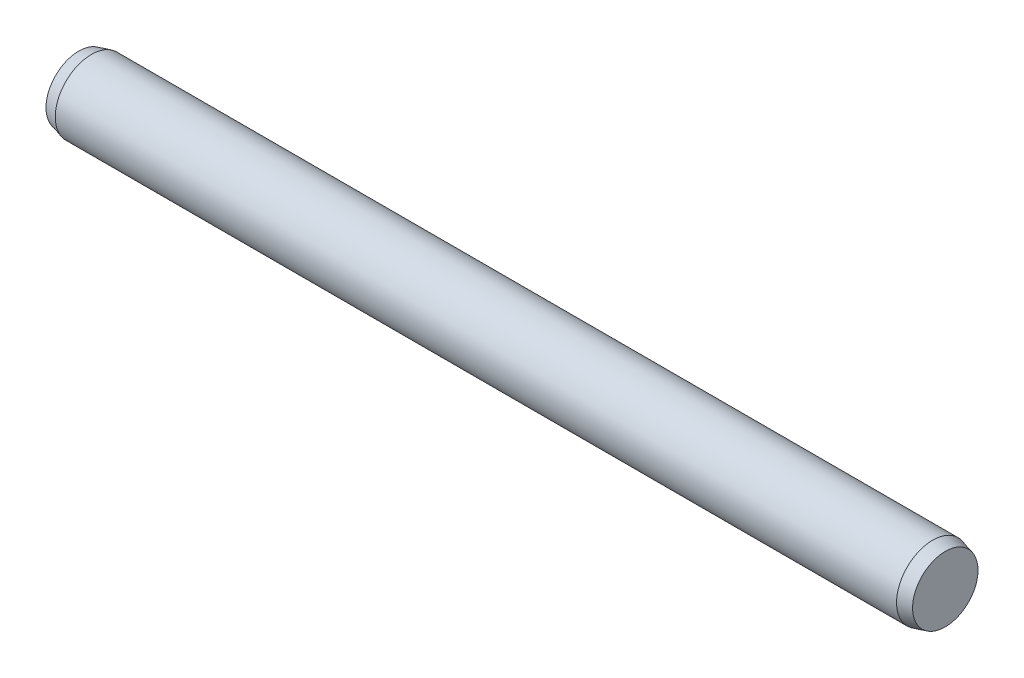
ISO-10303-21;
HEADER;
FILE_DESCRIPTION(('STEP AP214'),'2;1');
FILE_NAME('part.step','',(''),(''),'','','');
FILE_SCHEMA(('AUTOMOTIVE_DESIGN { 1 0 10303 214 1 1 1 1 }'));
ENDSEC;
DATA;
#1=APPLICATION_CONTEXT('core data for automotive mechanical design processes');
#2=APPLICATION_PROTOCOL_DEFINITION('international standard','automotive_design',2000,#1);
#3=PRODUCT_CONTEXT('',#1,'mechanical');
#4=PRODUCT('Part','Part','',(#3));
#5=PRODUCT_RELATED_PRODUCT_CATEGORY('part','',(#4));
#6=PRODUCT_DEFINITION_FORMATION('','',#4);
#7=PRODUCT_DEFINITION_CONTEXT('part definition',#1,'design');
#8=PRODUCT_DEFINITION('design','',#6,#7);
#9=PRODUCT_DEFINITION_SHAPE('','',#8);
#10=(LENGTH_UNIT() NAMED_UNIT(*) SI_UNIT(.MILLI.,.METRE.));
#11=(NAMED_UNIT(*) PLANE_ANGLE_UNIT() SI_UNIT($,.RADIAN.));
#12=(NAMED_UNIT(*) SI_UNIT($,.STERADIAN.) SOLID_ANGLE_UNIT());
#13=UNCERTAINTY_MEASURE_WITH_UNIT(LENGTH_MEASURE(1.E-05),#10,'distance_accuracy_value','');
#14=(GEOMETRIC_REPRESENTATION_CONTEXT(3) GLOBAL_UNCERTAINTY_ASSIGNED_CONTEXT((#13)) GLOBAL_UNIT_ASSIGNED_CONTEXT((#10,
#11,#12)) REPRESENTATION_CONTEXT('',''));
#15=CARTESIAN_POINT('',(0.,0.,0.));
#16=DIRECTION('',(0.,0.,1.));
#17=DIRECTION('',(1.,0.,0.));
#18=AXIS2_PLACEMENT_3D('',#15,#16,#17);
#19=CARTESIAN_POINT('',(-11.65,0.,0.));
#20=DIRECTION('',(1.,0.,0.));
#21=DIRECTION('',(0.,0.,-1.));
#22=AXIS2_PLACEMENT_3D('',#19,#20,#21);
#23=CYLINDRICAL_SURFACE('',#22,1.);
#24=CARTESIAN_POINT('',(-11.65,0.,0.));
#25=DIRECTION('',(-1.,0.,0.));
#26=DIRECTION('',(0.,0.,1.));
#27=AXIS2_PLACEMENT_3D('',#24,#25,#26);
#28=CIRCLE('',#27,1.);
#29=CARTESIAN_POINT('',(-11.65,0.,1.));
#30=VERTEX_POINT('',#29);
#31=EDGE_CURVE('E44',#30,#30,#28,.T.);
#32=ORIENTED_EDGE('',*,*,#31,.F.);
#33=EDGE_LOOP('',(#32));
#34=FACE_BOUND('',#33,.T.);
#35=CARTESIAN_POINT('',(11.65,0.,0.));
#36=DIRECTION('',(1.,0.,0.));
#37=DIRECTION('',(0.,0.,-1.));
#38=AXIS2_PLACEMENT_3D('',#35,#36,#37);
#39=CIRCLE('',#38,1.);
#40=CARTESIAN_POINT('',(11.65,0.,-1.));
#41=VERTEX_POINT('',#40);
#42=EDGE_CURVE('E10',#41,#41,#39,.T.);
#43=ORIENTED_EDGE('',*,*,#42,.F.);
#44=EDGE_LOOP('',(#43));
#45=FACE_BOUND('',#44,.T.);
#46=ADVANCED_FACE('F30',(#34,#45),#23,.T.);
#47=CARTESIAN_POINT('',(11.65,0.,0.));
#48=DIRECTION('',(-1.,0.,0.));
#49=DIRECTION('',(0.,0.,-1.));
#50=AXIS2_PLACEMENT_3D('',#47,#48,#49);
#51=CONICAL_SURFACE('',#50,1.,0.26179938779915);
#52=CARTESIAN_POINT('',(12.,0.,0.));
#53=DIRECTION('',(1.,0.,0.));
#54=DIRECTION('',(0.,0.,-1.));
#55=AXIS2_PLACEMENT_3D('',#52,#53,#54);
#56=CIRCLE('',#55,0.906217782649107);
#57=CARTESIAN_POINT('',(12.,0.,-0.906217782649107));
#58=VERTEX_POINT('',#57);
#59=EDGE_CURVE('E36',#58,#58,#56,.T.);
#60=ORIENTED_EDGE('',*,*,#59,.F.);
#61=EDGE_LOOP('',(#60));
#62=FACE_BOUND('',#61,.T.);
#63=ORIENTED_EDGE('',*,*,#42,.T.);
#64=EDGE_LOOP('',(#63));
#65=FACE_BOUND('',#64,.T.);
#66=ADVANCED_FACE('F54',(#62,#65),#51,.T.);
#67=CARTESIAN_POINT('',(12.,0.,0.));
#68=DIRECTION('',(1.,0.,0.));
#69=DIRECTION('',(0.,0.,-1.));
#70=AXIS2_PLACEMENT_3D('',#67,#68,#69);
#71=PLANE('',#70);
#72=ORIENTED_EDGE('',*,*,#59,.T.);
#73=EDGE_LOOP('',(#72));
#74=FACE_BOUND('',#73,.T.);
#75=ADVANCED_FACE('F58',(#74),#71,.T.);
#76=CARTESIAN_POINT('',(-11.65,0.,0.));
#77=DIRECTION('',(1.,0.,0.));
#78=DIRECTION('',(0.,0.,1.));
#79=AXIS2_PLACEMENT_3D('',#76,#77,#78);
#80=CONICAL_SURFACE('',#79,1.,0.26179938779915);
#81=CARTESIAN_POINT('',(-12.,0.,0.));
#82=DIRECTION('',(-1.,0.,0.));
#83=DIRECTION('',(0.,0.,1.));
#84=AXIS2_PLACEMENT_3D('',#81,#82,#83);
#85=CIRCLE('',#84,0.906217782649107);
#86=CARTESIAN_POINT('',(-12.,0.,0.906217782649107));
#87=VERTEX_POINT('',#86);
#88=EDGE_CURVE('E40',#87,#87,#85,.T.);
#89=ORIENTED_EDGE('',*,*,#88,.F.);
#90=EDGE_LOOP('',(#89));
#91=FACE_BOUND('',#90,.T.);
#92=ORIENTED_EDGE('',*,*,#31,.T.);
#93=EDGE_LOOP('',(#92));
#94=FACE_BOUND('',#93,.T.);
#95=ADVANCED_FACE('F50',(#91,#94),#80,.T.);
#96=CARTESIAN_POINT('',(-12.,0.,0.));
#97=DIRECTION('',(-1.,0.,0.));
#98=DIRECTION('',(0.,0.,1.));
#99=AXIS2_PLACEMENT_3D('',#96,#97,#98);
#100=PLANE('',#99);
#101=ORIENTED_EDGE('',*,*,#88,.T.);
#102=EDGE_LOOP('',(#101));
#103=FACE_BOUND('',#102,.T.);
#104=ADVANCED_FACE('F67',(#103),#100,.T.);
#105=CLOSED_SHELL('',(#46,#66,#75,#95,#104));
#106=MANIFOLD_SOLID_BREP('B2',#105);
#107=ADVANCED_BREP_SHAPE_REPRESENTATION('',(#18,#106),#14);
#108=SHAPE_DEFINITION_REPRESENTATION(#9,#107);
ENDSEC;
END-ISO-10303-21;
